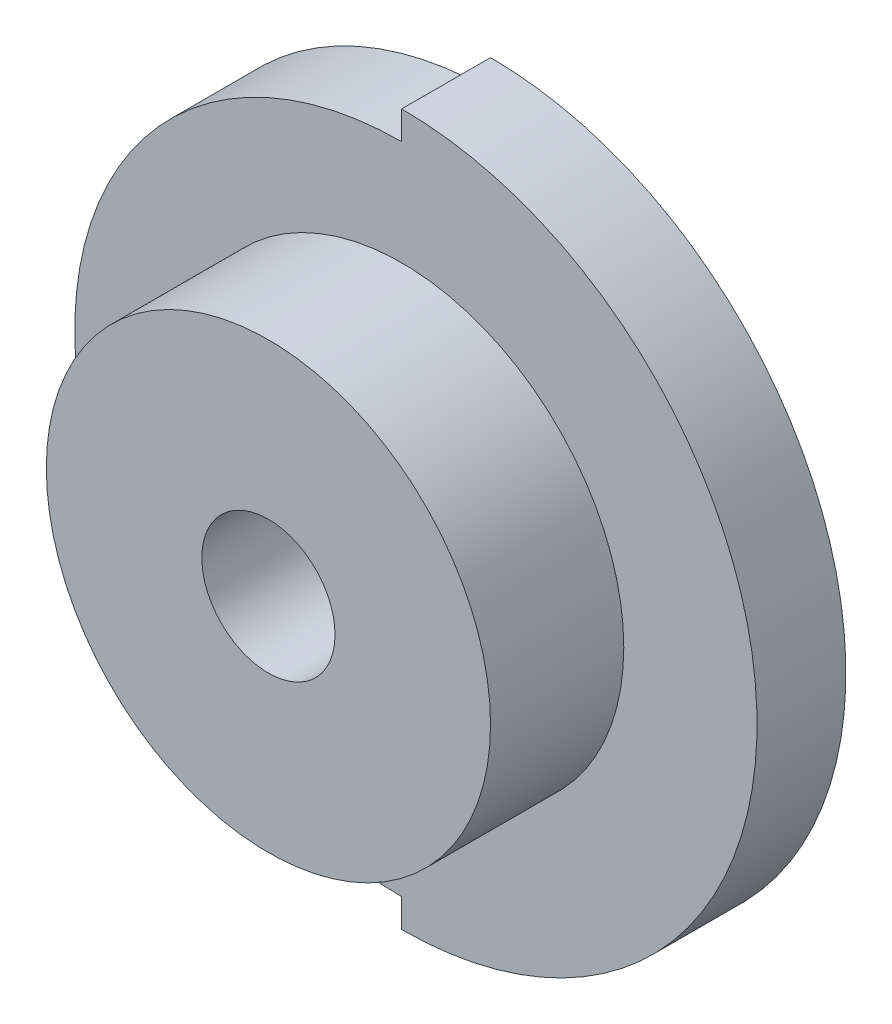
ISO-10303-21;
HEADER;
FILE_DESCRIPTION(('STEP AP214'),'2;1');
FILE_NAME('part.step','',(''),(''),'','','');
FILE_SCHEMA(('AUTOMOTIVE_DESIGN { 1 0 10303 214 1 1 1 1 }'));
ENDSEC;
DATA;
#1=APPLICATION_CONTEXT('core data for automotive mechanical design processes');
#2=APPLICATION_PROTOCOL_DEFINITION('international standard','automotive_design',2000,#1);
#3=PRODUCT_CONTEXT('',#1,'mechanical');
#4=PRODUCT('Part','Part','',(#3));
#5=PRODUCT_RELATED_PRODUCT_CATEGORY('part','',(#4));
#6=PRODUCT_DEFINITION_FORMATION('','',#4);
#7=PRODUCT_DEFINITION_CONTEXT('part definition',#1,'design');
#8=PRODUCT_DEFINITION('design','',#6,#7);
#9=PRODUCT_DEFINITION_SHAPE('','',#8);
#10=(LENGTH_UNIT() NAMED_UNIT(*) SI_UNIT(.MILLI.,.METRE.));
#11=(NAMED_UNIT(*) PLANE_ANGLE_UNIT() SI_UNIT($,.RADIAN.));
#12=(NAMED_UNIT(*) SI_UNIT($,.STERADIAN.) SOLID_ANGLE_UNIT());
#13=UNCERTAINTY_MEASURE_WITH_UNIT(LENGTH_MEASURE(1.E-05),#10,'distance_accuracy_value','');
#14=(GEOMETRIC_REPRESENTATION_CONTEXT(3) GLOBAL_UNCERTAINTY_ASSIGNED_CONTEXT((#13)) GLOBAL_UNIT_ASSIGNED_CONTEXT((#10,
#11,#12)) REPRESENTATION_CONTEXT('',''));
#15=CARTESIAN_POINT('',(0.,0.,0.));
#16=DIRECTION('',(0.,0.,1.));
#17=DIRECTION('',(1.,0.,0.));
#18=AXIS2_PLACEMENT_3D('',#15,#16,#17);
#19=CARTESIAN_POINT('',(0.,0.,6.35));
#20=DIRECTION('',(0.,0.,1.));
#21=DIRECTION('',(1.,0.,0.));
#22=AXIS2_PLACEMENT_3D('',#19,#20,#21);
#23=PLANE('',#22);
#24=DIRECTION('',(0.,-1.,0.));
#25=VECTOR('',#24,1.);
#26=CARTESIAN_POINT('',(0.,25.4,6.35));
#27=LINE('',#26,#25);
#28=CARTESIAN_POINT('',(0.,25.4,6.35));
#29=VERTEX_POINT('',#28);
#30=CARTESIAN_POINT('',(0.,23.368,6.35));
#31=VERTEX_POINT('',#30);
#32=EDGE_CURVE('E74',#29,#31,#27,.T.);
#33=ORIENTED_EDGE('',*,*,#32,.T.);
#34=CARTESIAN_POINT('',(0.,0.,6.35));
#35=DIRECTION('',(0.,0.,1.));
#36=DIRECTION('',(1.,0.,0.));
#37=AXIS2_PLACEMENT_3D('',#34,#35,#36);
#38=CIRCLE('',#37,23.368);
#39=CARTESIAN_POINT('',(0.,-23.368,6.35));
#40=VERTEX_POINT('',#39);
#41=EDGE_CURVE('E78',#31,#40,#38,.T.);
#42=ORIENTED_EDGE('',*,*,#41,.T.);
#43=DIRECTION('',(0.,-1.,0.));
#44=VECTOR('',#43,1.);
#45=CARTESIAN_POINT('',(0.,-23.368,6.35));
#46=LINE('',#45,#44);
#47=CARTESIAN_POINT('',(0.,-25.4,6.35));
#48=VERTEX_POINT('',#47);
#49=EDGE_CURVE('E96',#40,#48,#46,.T.);
#50=ORIENTED_EDGE('',*,*,#49,.T.);
#51=CARTESIAN_POINT('',(0.,0.,6.35));
#52=DIRECTION('',(0.,0.,1.));
#53=DIRECTION('',(1.,0.,0.));
#54=AXIS2_PLACEMENT_3D('',#51,#52,#53);
#55=CIRCLE('',#54,25.4);
#56=EDGE_CURVE('E11',#48,#29,#55,.T.);
#57=ORIENTED_EDGE('',*,*,#56,.T.);
#58=EDGE_LOOP('',(#33,#42,#50,#57));
#59=FACE_BOUND('',#58,.T.);
#60=CARTESIAN_POINT('',(0.,0.,6.35));
#61=DIRECTION('',(0.,0.,1.));
#62=DIRECTION('',(1.,0.,0.));
#63=AXIS2_PLACEMENT_3D('',#60,#61,#62);
#64=CIRCLE('',#63,15.875);
#65=CARTESIAN_POINT('',(-15.875,0.,6.35));
#66=VERTEX_POINT('',#65);
#67=EDGE_CURVE('E109',#66,#66,#64,.T.);
#68=ORIENTED_EDGE('',*,*,#67,.F.);
#69=EDGE_LOOP('',(#68));
#70=FACE_BOUND('',#69,.T.);
#71=ADVANCED_FACE('F34',(#59,#70),#23,.T.);
#72=CARTESIAN_POINT('',(0.,0.,6.35));
#73=DIRECTION('',(0.,0.,-1.));
#74=DIRECTION('',(-1.,0.,0.));
#75=AXIS2_PLACEMENT_3D('',#72,#73,#74);
#76=CYLINDRICAL_SURFACE('',#75,25.4);
#77=CARTESIAN_POINT('',(0.,0.,0.));
#78=DIRECTION('',(0.,0.,1.));
#79=DIRECTION('',(1.,0.,0.));
#80=AXIS2_PLACEMENT_3D('',#77,#78,#79);
#81=CIRCLE('',#80,25.4);
#82=CARTESIAN_POINT('',(0.,-25.4,0.));
#83=VERTEX_POINT('',#82);
#84=CARTESIAN_POINT('',(0.,25.4,0.));
#85=VERTEX_POINT('',#84);
#86=EDGE_CURVE('E38',#83,#85,#81,.T.);
#87=ORIENTED_EDGE('',*,*,#86,.T.);
#88=DIRECTION('',(0.,0.,-1.));
#89=VECTOR('',#88,1.);
#90=CARTESIAN_POINT('',(0.,25.4,63.1461266284947));
#91=LINE('',#90,#89);
#92=EDGE_CURVE('E58',#29,#85,#91,.T.);
#93=ORIENTED_EDGE('',*,*,#92,.F.);
#94=ORIENTED_EDGE('',*,*,#56,.F.);
#95=DIRECTION('',(0.,0.,-1.));
#96=VECTOR('',#95,1.);
#97=CARTESIAN_POINT('',(0.,-25.4,63.1461266284947));
#98=LINE('',#97,#96);
#99=EDGE_CURVE('E97',#48,#83,#98,.T.);
#100=ORIENTED_EDGE('',*,*,#99,.T.);
#101=EDGE_LOOP('',(#87,#93,#94,#100));
#102=FACE_BOUND('',#101,.T.);
#103=ADVANCED_FACE('F36',(#102),#76,.T.);
#104=CARTESIAN_POINT('',(0.,0.,0.));
#105=DIRECTION('',(0.,0.,1.));
#106=DIRECTION('',(1.,0.,0.));
#107=AXIS2_PLACEMENT_3D('',#104,#105,#106);
#108=PLANE('',#107);
#109=CARTESIAN_POINT('',(0.,0.,0.));
#110=DIRECTION('',(0.,0.,1.));
#111=DIRECTION('',(1.,0.,0.));
#112=AXIS2_PLACEMENT_3D('',#109,#110,#111);
#113=CIRCLE('',#112,4.7625);
#114=CARTESIAN_POINT('',(4.7625,0.,0.));
#115=VERTEX_POINT('',#114);
#116=EDGE_CURVE('E106',#115,#115,#113,.F.);
#117=ORIENTED_EDGE('',*,*,#116,.F.);
#118=EDGE_LOOP('',(#117));
#119=FACE_BOUND('',#118,.T.);
#120=CARTESIAN_POINT('',(0.,0.,0.));
#121=DIRECTION('',(0.,0.,1.));
#122=DIRECTION('',(-1.,0.,0.));
#123=AXIS2_PLACEMENT_3D('',#120,#121,#122);
#124=CIRCLE('',#123,23.368);
#125=CARTESIAN_POINT('',(0.,23.368,0.));
#126=VERTEX_POINT('',#125);
#127=CARTESIAN_POINT('',(0.,-23.368,0.));
#128=VERTEX_POINT('',#127);
#129=EDGE_CURVE('E49',#126,#128,#124,.T.);
#130=ORIENTED_EDGE('',*,*,#129,.F.);
#131=DIRECTION('',(0.,-1.,0.));
#132=VECTOR('',#131,1.);
#133=CARTESIAN_POINT('',(0.,25.4,0.));
#134=LINE('',#133,#132);
#135=EDGE_CURVE('E86',#85,#126,#134,.T.);
#136=ORIENTED_EDGE('',*,*,#135,.F.);
#137=ORIENTED_EDGE('',*,*,#86,.F.);
#138=DIRECTION('',(0.,-1.,0.));
#139=VECTOR('',#138,1.);
#140=CARTESIAN_POINT('',(0.,-23.368,0.));
#141=LINE('',#140,#139);
#142=EDGE_CURVE('E90',#128,#83,#141,.T.);
#143=ORIENTED_EDGE('',*,*,#142,.F.);
#144=EDGE_LOOP('',(#130,#136,#137,#143));
#145=FACE_BOUND('',#144,.T.);
#146=ADVANCED_FACE('F122',(#119,#145),#108,.F.);
#147=CARTESIAN_POINT('',(0.,0.,15.875));
#148=DIRECTION('',(0.,0.,-1.));
#149=DIRECTION('',(-1.,0.,0.));
#150=AXIS2_PLACEMENT_3D('',#147,#148,#149);
#151=CYLINDRICAL_SURFACE('',#150,15.875);
#152=CARTESIAN_POINT('',(0.,0.,15.875));
#153=DIRECTION('',(0.,0.,1.));
#154=DIRECTION('',(1.,0.,0.));
#155=AXIS2_PLACEMENT_3D('',#152,#153,#154);
#156=CIRCLE('',#155,15.875);
#157=CARTESIAN_POINT('',(-15.875,0.,15.875));
#158=VERTEX_POINT('',#157);
#159=EDGE_CURVE('E110',#158,#158,#156,.T.);
#160=CARTESIAN_POINT('',(-15.875,0.,15.875));
#161=CARTESIAN_POINT('',(-15.875,0.,15.77578125));
#162=CARTESIAN_POINT('',(-15.875,0.,15.6765625));
#163=CARTESIAN_POINT('',(-15.875,0.,15.478125));
#164=CARTESIAN_POINT('',(-15.875,0.,15.37890625));
#165=CARTESIAN_POINT('',(-15.875,0.,15.18046875));
#166=CARTESIAN_POINT('',(-15.875,0.,15.08125));
#167=CARTESIAN_POINT('',(-15.875,0.,14.8828125));
#168=CARTESIAN_POINT('',(-15.875,0.,14.78359375));
#169=CARTESIAN_POINT('',(-15.875,0.,14.58515625));
#170=CARTESIAN_POINT('',(-15.875,0.,14.4859375));
#171=CARTESIAN_POINT('',(-15.875,0.,14.2875));
#172=CARTESIAN_POINT('',(-15.875,0.,14.18828125));
#173=CARTESIAN_POINT('',(-15.875,0.,13.98984375));
#174=CARTESIAN_POINT('',(-15.875,0.,13.890625));
#175=CARTESIAN_POINT('',(-15.875,0.,13.6921875));
#176=CARTESIAN_POINT('',(-15.875,0.,13.59296875));
#177=CARTESIAN_POINT('',(-15.875,0.,13.39453125));
#178=CARTESIAN_POINT('',(-15.875,0.,13.2953125));
#179=CARTESIAN_POINT('',(-15.875,0.,13.096875));
#180=CARTESIAN_POINT('',(-15.875,0.,12.99765625));
#181=CARTESIAN_POINT('',(-15.875,0.,12.79921875));
#182=CARTESIAN_POINT('',(-15.875,0.,12.7));
#183=CARTESIAN_POINT('',(-15.875,0.,12.5015625));
#184=CARTESIAN_POINT('',(-15.875,0.,12.40234375));
#185=CARTESIAN_POINT('',(-15.875,0.,12.20390625));
#186=CARTESIAN_POINT('',(-15.875,0.,12.1046875));
#187=CARTESIAN_POINT('',(-15.875,0.,11.90625));
#188=CARTESIAN_POINT('',(-15.875,0.,11.80703125));
#189=CARTESIAN_POINT('',(-15.875,0.,11.60859375));
#190=CARTESIAN_POINT('',(-15.875,0.,11.509375));
#191=CARTESIAN_POINT('',(-15.875,0.,11.3109375));
#192=CARTESIAN_POINT('',(-15.875,0.,11.21171875));
#193=CARTESIAN_POINT('',(-15.875,0.,11.01328125));
#194=CARTESIAN_POINT('',(-15.875,0.,10.9140625));
#195=CARTESIAN_POINT('',(-15.875,0.,10.715625));
#196=CARTESIAN_POINT('',(-15.875,0.,10.61640625));
#197=CARTESIAN_POINT('',(-15.875,0.,10.41796875));
#198=CARTESIAN_POINT('',(-15.875,0.,10.31875));
#199=CARTESIAN_POINT('',(-15.875,0.,10.1203125));
#200=CARTESIAN_POINT('',(-15.875,0.,10.02109375));
#201=CARTESIAN_POINT('',(-15.875,0.,9.82265625));
#202=CARTESIAN_POINT('',(-15.875,0.,9.7234375));
#203=CARTESIAN_POINT('',(-15.875,0.,9.525));
#204=CARTESIAN_POINT('',(-15.875,0.,9.42578125));
#205=CARTESIAN_POINT('',(-15.875,0.,9.22734375));
#206=CARTESIAN_POINT('',(-15.875,0.,9.128125));
#207=CARTESIAN_POINT('',(-15.875,0.,8.9296875));
#208=CARTESIAN_POINT('',(-15.875,0.,8.83046875));
#209=CARTESIAN_POINT('',(-15.875,0.,8.63203125));
#210=CARTESIAN_POINT('',(-15.875,0.,8.5328125));
#211=CARTESIAN_POINT('',(-15.875,0.,8.334375));
#212=CARTESIAN_POINT('',(-15.875,0.,8.23515625));
#213=CARTESIAN_POINT('',(-15.875,0.,8.03671875));
#214=CARTESIAN_POINT('',(-15.875,0.,7.9375));
#215=CARTESIAN_POINT('',(-15.875,0.,7.7390625));
#216=CARTESIAN_POINT('',(-15.875,0.,7.63984375));
#217=CARTESIAN_POINT('',(-15.875,0.,7.44140625));
#218=CARTESIAN_POINT('',(-15.875,0.,7.3421875));
#219=CARTESIAN_POINT('',(-15.875,0.,7.14375));
#220=CARTESIAN_POINT('',(-15.875,0.,7.04453125));
#221=CARTESIAN_POINT('',(-15.875,0.,6.84609375));
#222=CARTESIAN_POINT('',(-15.875,0.,6.746875));
#223=CARTESIAN_POINT('',(-15.875,0.,6.5484375));
#224=CARTESIAN_POINT('',(-15.875,0.,6.44921875));
#225=CARTESIAN_POINT('',(-15.875,0.,6.35));
#226=B_SPLINE_CURVE_WITH_KNOTS('',3,(#160,#161,#162,#163,#164,#165,#166,#167,#168,#169,#170,
#171,#172,#173,#174,#175,#176,#177,#178,#179,#180,#181,#182,#183,#184,#185,#186,#187,#188,#189,
#190,#191,#192,#193,#194,#195,#196,#197,#198,#199,#200,#201,#202,#203,#204,#205,#206,#207,#208,
#209,#210,#211,#212,#213,#214,#215,#216,#217,#218,#219,#220,#221,#222,#223,#224,#225),
.UNSPECIFIED.,.F.,.F.,(4,2,2,2,2,2,2,2,2,2,2,2,2,2,2,2,2,2,2,2,2,2,2,2,2,2,2,2,2,2,2,2,4),(0.,
0.297656249999998,0.595312499999999,0.892968749999999,1.190625,1.48828125,1.7859375,2.08359375,
2.38125,2.67890625,2.9765625,3.27421875,3.571875,3.86953125,4.1671875,4.46484375,4.7625,
5.06015625,5.3578125,5.65546875,5.953125,6.25078125,6.5484375,6.84609375,7.14375,7.44140625,
7.7390625,8.03671875,8.334375,8.63203125,8.9296875,9.22734375,9.525),.UNSPECIFIED.);
#227=EDGE_CURVE('BSEAM116',#158,#66,#226,.T.);
#228=ORIENTED_EDGE('',*,*,#159,.F.);
#229=ORIENTED_EDGE('',*,*,#67,.T.);
#230=ORIENTED_EDGE('',*,*,#227,.T.);
#231=ORIENTED_EDGE('',*,*,#227,.F.);
#232=EDGE_LOOP('',(#228,#230,#229,#231));
#233=FACE_BOUND('',#232,.T.);
#234=ADVANCED_FACE('F116',(#233),#151,.T.);
#235=CARTESIAN_POINT('',(0.,0.,15.875));
#236=DIRECTION('',(0.,0.,1.));
#237=DIRECTION('',(1.,0.,0.));
#238=AXIS2_PLACEMENT_3D('',#235,#236,#237);
#239=PLANE('',#238);
#240=CARTESIAN_POINT('',(0.,0.,15.875));
#241=DIRECTION('',(0.,0.,1.));
#242=DIRECTION('',(1.,0.,0.));
#243=AXIS2_PLACEMENT_3D('',#240,#241,#242);
#244=CIRCLE('',#243,4.7625);
#245=CARTESIAN_POINT('',(4.7625,0.,15.875));
#246=VERTEX_POINT('',#245);
#247=EDGE_CURVE('E103',#246,#246,#244,.T.);
#248=ORIENTED_EDGE('',*,*,#247,.F.);
#249=EDGE_LOOP('',(#248));
#250=FACE_BOUND('',#249,.T.);
#251=ORIENTED_EDGE('',*,*,#159,.T.);
#252=EDGE_LOOP('',(#251));
#253=FACE_BOUND('',#252,.T.);
#254=ADVANCED_FACE('F131',(#250,#253),#239,.T.);
#255=CARTESIAN_POINT('',(0.,0.,-13.4703841816037));
#256=DIRECTION('',(0.,0.,1.));
#257=DIRECTION('',(1.,0.,0.));
#258=AXIS2_PLACEMENT_3D('',#255,#256,#257);
#259=CYLINDRICAL_SURFACE('',#258,4.7625);
#260=ORIENTED_EDGE('',*,*,#116,.T.);
#261=EDGE_LOOP('',(#260));
#262=FACE_BOUND('',#261,.T.);
#263=ORIENTED_EDGE('',*,*,#247,.T.);
#264=EDGE_LOOP('',(#263));
#265=FACE_BOUND('',#264,.T.);
#266=ADVANCED_FACE('F149',(#262,#265),#259,.F.);
#267=CARTESIAN_POINT('',(0.,25.4,63.1461266284947));
#268=DIRECTION('',(1.,0.,0.));
#269=DIRECTION('',(0.,0.,-1.));
#270=AXIS2_PLACEMENT_3D('',#267,#268,#269);
#271=PLANE('',#270);
#272=ORIENTED_EDGE('',*,*,#92,.T.);
#273=ORIENTED_EDGE('',*,*,#135,.T.);
#274=DIRECTION('',(0.,0.,-1.));
#275=VECTOR('',#274,1.);
#276=CARTESIAN_POINT('',(0.,23.368,63.1461266284947));
#277=LINE('',#276,#275);
#278=EDGE_CURVE('E80',#31,#126,#277,.T.);
#279=ORIENTED_EDGE('',*,*,#278,.F.);
#280=ORIENTED_EDGE('',*,*,#32,.F.);
#281=EDGE_LOOP('',(#272,#273,#279,#280));
#282=FACE_BOUND('',#281,.T.);
#283=ADVANCED_FACE('F85',(#282),#271,.F.);
#284=CARTESIAN_POINT('',(0.,0.,63.1461266284947));
#285=DIRECTION('',(0.,0.,-1.));
#286=DIRECTION('',(-1.,0.,0.));
#287=AXIS2_PLACEMENT_3D('',#284,#285,#286);
#288=CYLINDRICAL_SURFACE('',#287,23.368);
#289=ORIENTED_EDGE('',*,*,#278,.T.);
#290=ORIENTED_EDGE('',*,*,#129,.T.);
#291=DIRECTION('',(0.,0.,-1.));
#292=VECTOR('',#291,1.);
#293=CARTESIAN_POINT('',(0.,-23.368,63.1461266284947));
#294=LINE('',#293,#292);
#295=EDGE_CURVE('E81',#40,#128,#294,.T.);
#296=ORIENTED_EDGE('',*,*,#295,.F.);
#297=ORIENTED_EDGE('',*,*,#41,.F.);
#298=EDGE_LOOP('',(#289,#290,#296,#297));
#299=FACE_BOUND('',#298,.T.);
#300=ADVANCED_FACE('F79',(#299),#288,.T.);
#301=CARTESIAN_POINT('',(0.,-23.368,63.1461266284947));
#302=DIRECTION('',(1.,0.,0.));
#303=DIRECTION('',(0.,0.,-1.));
#304=AXIS2_PLACEMENT_3D('',#301,#302,#303);
#305=PLANE('',#304);
#306=ORIENTED_EDGE('',*,*,#295,.T.);
#307=ORIENTED_EDGE('',*,*,#142,.T.);
#308=ORIENTED_EDGE('',*,*,#99,.F.);
#309=ORIENTED_EDGE('',*,*,#49,.F.);
#310=EDGE_LOOP('',(#306,#307,#308,#309));
#311=FACE_BOUND('',#310,.T.);
#312=ADVANCED_FACE('F139',(#311),#305,.F.);
#313=CLOSED_SHELL('',(#71,#103,#146,#234,#254,#266,#283,#300,#312));
#314=MANIFOLD_SOLID_BREP('B2',#313);
#315=ADVANCED_BREP_SHAPE_REPRESENTATION('',(#18,#314),#14);
#316=SHAPE_DEFINITION_REPRESENTATION(#9,#315);
ENDSEC;
END-ISO-10303-21;
